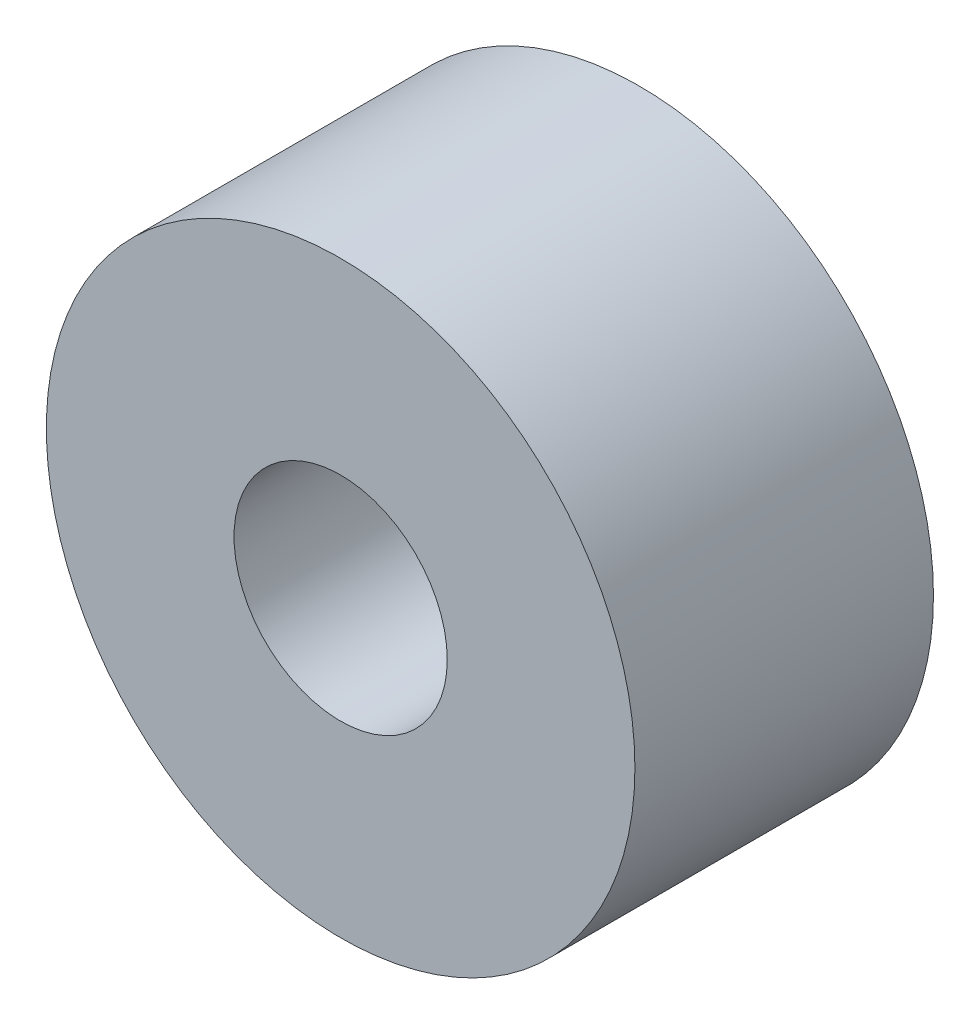
ISO-10303-21;
HEADER;
FILE_DESCRIPTION(('STEP AP214'),'2;1');
FILE_NAME('part.step','',(''),(''),'','','');
FILE_SCHEMA(('AUTOMOTIVE_DESIGN { 1 0 10303 214 1 1 1 1 }'));
ENDSEC;
DATA;
#1=APPLICATION_CONTEXT('core data for automotive mechanical design processes');
#2=APPLICATION_PROTOCOL_DEFINITION('international standard','automotive_design',2000,#1);
#3=PRODUCT_CONTEXT('',#1,'mechanical');
#4=PRODUCT('Part','Part','',(#3));
#5=PRODUCT_RELATED_PRODUCT_CATEGORY('part','',(#4));
#6=PRODUCT_DEFINITION_FORMATION('','',#4);
#7=PRODUCT_DEFINITION_CONTEXT('part definition',#1,'design');
#8=PRODUCT_DEFINITION('design','',#6,#7);
#9=PRODUCT_DEFINITION_SHAPE('','',#8);
#10=(LENGTH_UNIT() NAMED_UNIT(*) SI_UNIT(.MILLI.,.METRE.));
#11=(NAMED_UNIT(*) PLANE_ANGLE_UNIT() SI_UNIT($,.RADIAN.));
#12=(NAMED_UNIT(*) SI_UNIT($,.STERADIAN.) SOLID_ANGLE_UNIT());
#13=UNCERTAINTY_MEASURE_WITH_UNIT(LENGTH_MEASURE(1.E-05),#10,'distance_accuracy_value','');
#14=(GEOMETRIC_REPRESENTATION_CONTEXT(3) GLOBAL_UNCERTAINTY_ASSIGNED_CONTEXT((#13)) GLOBAL_UNIT_ASSIGNED_CONTEXT((#10,
#11,#12)) REPRESENTATION_CONTEXT('',''));
#15=CARTESIAN_POINT('',(0.,0.,0.));
#16=DIRECTION('',(0.,0.,1.));
#17=DIRECTION('',(1.,0.,0.));
#18=AXIS2_PLACEMENT_3D('',#15,#16,#17);
#19=CARTESIAN_POINT('',(0.,0.,17.78));
#20=DIRECTION('',(0.,0.,1.));
#21=DIRECTION('',(1.,0.,0.));
#22=AXIS2_PLACEMENT_3D('',#19,#20,#21);
#23=PLANE('',#22);
#24=CARTESIAN_POINT('',(0.,0.,17.78));
#25=DIRECTION('',(0.,0.,1.));
#26=DIRECTION('',(1.,0.,0.));
#27=AXIS2_PLACEMENT_3D('',#24,#25,#26);
#28=CIRCLE('',#27,17.526);
#29=CARTESIAN_POINT('',(17.526,0.,17.78));
#30=VERTEX_POINT('',#29);
#31=EDGE_CURVE('E10',#30,#30,#28,.T.);
#32=ORIENTED_EDGE('',*,*,#31,.T.);
#33=EDGE_LOOP('',(#32));
#34=FACE_BOUND('',#33,.T.);
#35=CARTESIAN_POINT('',(0.,0.,17.78));
#36=DIRECTION('',(0.,0.,1.));
#37=DIRECTION('',(1.,0.,0.));
#38=AXIS2_PLACEMENT_3D('',#35,#36,#37);
#39=CIRCLE('',#38,6.35);
#40=CARTESIAN_POINT('',(6.35,0.,17.78));
#41=VERTEX_POINT('',#40);
#42=EDGE_CURVE('E52',#41,#41,#39,.T.);
#43=ORIENTED_EDGE('',*,*,#42,.F.);
#44=EDGE_LOOP('',(#43));
#45=FACE_BOUND('',#44,.T.);
#46=ADVANCED_FACE('F39',(#34,#45),#23,.T.);
#47=CARTESIAN_POINT('',(0.,0.,0.));
#48=DIRECTION('',(0.,0.,1.));
#49=DIRECTION('',(1.,0.,0.));
#50=AXIS2_PLACEMENT_3D('',#47,#48,#49);
#51=PLANE('',#50);
#52=CARTESIAN_POINT('',(0.,0.,0.));
#53=DIRECTION('',(0.,0.,1.));
#54=DIRECTION('',(1.,0.,0.));
#55=AXIS2_PLACEMENT_3D('',#52,#53,#54);
#56=CIRCLE('',#55,17.526);
#57=CARTESIAN_POINT('',(17.526,0.,0.));
#58=VERTEX_POINT('',#57);
#59=EDGE_CURVE('E43',#58,#58,#56,.T.);
#60=ORIENTED_EDGE('',*,*,#59,.F.);
#61=EDGE_LOOP('',(#60));
#62=FACE_BOUND('',#61,.T.);
#63=CARTESIAN_POINT('',(0.,0.,0.));
#64=DIRECTION('',(0.,0.,1.));
#65=DIRECTION('',(1.,0.,0.));
#66=AXIS2_PLACEMENT_3D('',#63,#64,#65);
#67=CIRCLE('',#66,6.35);
#68=CARTESIAN_POINT('',(6.35,0.,0.));
#69=VERTEX_POINT('',#68);
#70=EDGE_CURVE('E54',#69,#69,#67,.T.);
#71=ORIENTED_EDGE('',*,*,#70,.T.);
#72=EDGE_LOOP('',(#71));
#73=FACE_BOUND('',#72,.T.);
#74=ADVANCED_FACE('F66',(#62,#73),#51,.F.);
#75=CARTESIAN_POINT('',(0.,0.,17.78));
#76=DIRECTION('',(0.,0.,-1.));
#77=DIRECTION('',(-1.,0.,0.));
#78=AXIS2_PLACEMENT_3D('',#75,#76,#77);
#79=CYLINDRICAL_SURFACE('',#78,17.526);
#80=ORIENTED_EDGE('',*,*,#31,.F.);
#81=EDGE_LOOP('',(#80));
#82=FACE_BOUND('',#81,.T.);
#83=ORIENTED_EDGE('',*,*,#59,.T.);
#84=EDGE_LOOP('',(#83));
#85=FACE_BOUND('',#84,.T.);
#86=ADVANCED_FACE('F41',(#82,#85),#79,.T.);
#87=CARTESIAN_POINT('',(0.,0.,17.78));
#88=DIRECTION('',(0.,0.,-1.));
#89=DIRECTION('',(-1.,0.,0.));
#90=AXIS2_PLACEMENT_3D('',#87,#88,#89);
#91=CYLINDRICAL_SURFACE('',#90,6.35);
#92=ORIENTED_EDGE('',*,*,#42,.T.);
#93=EDGE_LOOP('',(#92));
#94=FACE_BOUND('',#93,.T.);
#95=ORIENTED_EDGE('',*,*,#70,.F.);
#96=EDGE_LOOP('',(#95));
#97=FACE_BOUND('',#96,.T.);
#98=ADVANCED_FACE('F62',(#94,#97),#91,.F.);
#99=CLOSED_SHELL('',(#46,#74,#86,#98));
#100=MANIFOLD_SOLID_BREP('B2',#99);
#101=ADVANCED_BREP_SHAPE_REPRESENTATION('',(#18,#100),#14);
#102=SHAPE_DEFINITION_REPRESENTATION(#9,#101);
ENDSEC;
END-ISO-10303-21;
